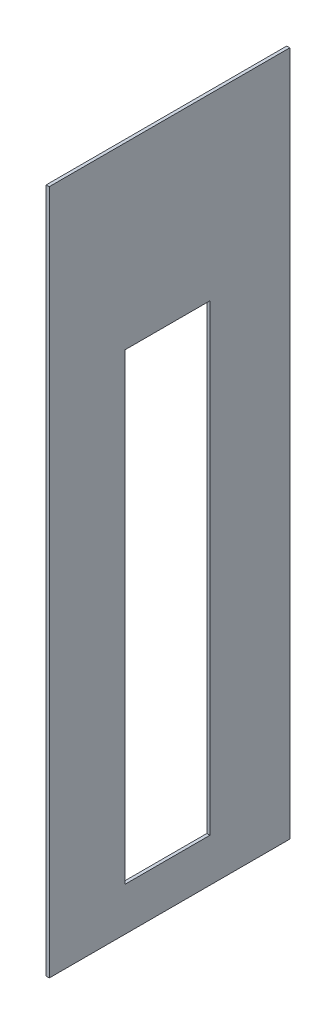
ISO-10303-21;
HEADER;
FILE_DESCRIPTION(('STEP AP214'),'2;1');
FILE_NAME('part.step','',(''),(''),'','','');
FILE_SCHEMA(('AUTOMOTIVE_DESIGN { 1 0 10303 214 1 1 1 1 }'));
ENDSEC;
DATA;
#1=APPLICATION_CONTEXT('core data for automotive mechanical design processes');
#2=APPLICATION_PROTOCOL_DEFINITION('international standard','automotive_design',2000,#1);
#3=PRODUCT_CONTEXT('',#1,'mechanical');
#4=PRODUCT('Part','Part','',(#3));
#5=PRODUCT_RELATED_PRODUCT_CATEGORY('part','',(#4));
#6=PRODUCT_DEFINITION_FORMATION('','',#4);
#7=PRODUCT_DEFINITION_CONTEXT('part definition',#1,'design');
#8=PRODUCT_DEFINITION('design','',#6,#7);
#9=PRODUCT_DEFINITION_SHAPE('','',#8);
#10=(LENGTH_UNIT() NAMED_UNIT(*) SI_UNIT(.MILLI.,.METRE.));
#11=(NAMED_UNIT(*) PLANE_ANGLE_UNIT() SI_UNIT($,.RADIAN.));
#12=(NAMED_UNIT(*) SI_UNIT($,.STERADIAN.) SOLID_ANGLE_UNIT());
#13=UNCERTAINTY_MEASURE_WITH_UNIT(LENGTH_MEASURE(1.E-05),#10,'distance_accuracy_value','');
#14=(GEOMETRIC_REPRESENTATION_CONTEXT(3) GLOBAL_UNCERTAINTY_ASSIGNED_CONTEXT((#13)) GLOBAL_UNIT_ASSIGNED_CONTEXT((#10,
#11,#12)) REPRESENTATION_CONTEXT('',''));
#15=CARTESIAN_POINT('',(0.,0.,0.));
#16=DIRECTION('',(0.,0.,1.));
#17=DIRECTION('',(1.,0.,0.));
#18=AXIS2_PLACEMENT_3D('',#15,#16,#17);
#19=CARTESIAN_POINT('',(1.,-9.84999999999989,3.40000000000003));
#20=DIRECTION('',(0.,-1.,0.));
#21=DIRECTION('',(0.,0.,-1.));
#22=AXIS2_PLACEMENT_3D('',#19,#20,#21);
#23=PLANE('',#22);
#24=DIRECTION('',(0.,0.,1.));
#25=VECTOR('',#24,1.);
#26=CARTESIAN_POINT('',(0.5,-9.84999999999989,3.40000000000003));
#27=LINE('',#26,#25);
#28=CARTESIAN_POINT('',(0.5,-9.84999999999989,3.40000000000003));
#29=VERTEX_POINT('',#28);
#30=CARTESIAN_POINT('',(0.5,-9.84999999999989,42.25));
#31=VERTEX_POINT('',#30);
#32=EDGE_CURVE('E132',#29,#31,#27,.T.);
#33=ORIENTED_EDGE('',*,*,#32,.F.);
#34=DIRECTION('',(-1.,0.,0.));
#35=VECTOR('',#34,1.);
#36=CARTESIAN_POINT('',(1.,-9.84999999999989,3.40000000000003));
#37=LINE('',#36,#35);
#38=CARTESIAN_POINT('',(1.,-9.84999999999989,3.40000000000003));
#39=VERTEX_POINT('',#38);
#40=EDGE_CURVE('E11',#39,#29,#37,.T.);
#41=ORIENTED_EDGE('',*,*,#40,.F.);
#42=DIRECTION('',(0.,0.,1.));
#43=VECTOR('',#42,1.);
#44=CARTESIAN_POINT('',(1.,-9.84999999999989,3.40000000000003));
#45=LINE('',#44,#43);
#46=CARTESIAN_POINT('',(1.,-9.84999999999989,42.25));
#47=VERTEX_POINT('',#46);
#48=EDGE_CURVE('E136',#39,#47,#45,.T.);
#49=ORIENTED_EDGE('',*,*,#48,.T.);
#50=DIRECTION('',(-1.,0.,0.));
#51=VECTOR('',#50,1.);
#52=CARTESIAN_POINT('',(1.,-9.84999999999989,42.25));
#53=LINE('',#52,#51);
#54=EDGE_CURVE('E37',#47,#31,#53,.T.);
#55=ORIENTED_EDGE('',*,*,#54,.T.);
#56=EDGE_LOOP('',(#33,#41,#49,#55));
#57=FACE_BOUND('',#56,.T.);
#58=ADVANCED_FACE('F34',(#57),#23,.T.);
#59=CARTESIAN_POINT('',(1.,100.85,3.40000000000002));
#60=DIRECTION('',(0.,0.,-1.));
#61=DIRECTION('',(0.,1.,0.));
#62=AXIS2_PLACEMENT_3D('',#59,#60,#61);
#63=PLANE('',#62);
#64=DIRECTION('',(0.,-1.,0.));
#65=VECTOR('',#64,1.);
#66=CARTESIAN_POINT('',(0.5,100.85,3.40000000000002));
#67=LINE('',#66,#65);
#68=CARTESIAN_POINT('',(0.5,100.85,3.40000000000002));
#69=VERTEX_POINT('',#68);
#70=EDGE_CURVE('E140',#69,#29,#67,.T.);
#71=ORIENTED_EDGE('',*,*,#70,.F.);
#72=DIRECTION('',(-1.,0.,0.));
#73=VECTOR('',#72,1.);
#74=CARTESIAN_POINT('',(1.,100.85,3.40000000000002));
#75=LINE('',#74,#73);
#76=CARTESIAN_POINT('',(1.,100.85,3.40000000000002));
#77=VERTEX_POINT('',#76);
#78=EDGE_CURVE('E42',#77,#69,#75,.T.);
#79=ORIENTED_EDGE('',*,*,#78,.F.);
#80=DIRECTION('',(0.,-1.,0.));
#81=VECTOR('',#80,1.);
#82=CARTESIAN_POINT('',(1.,100.85,3.40000000000002));
#83=LINE('',#82,#81);
#84=EDGE_CURVE('E146',#77,#39,#83,.T.);
#85=ORIENTED_EDGE('',*,*,#84,.T.);
#86=ORIENTED_EDGE('',*,*,#40,.T.);
#87=EDGE_LOOP('',(#71,#79,#85,#86));
#88=FACE_BOUND('',#87,.T.);
#89=ADVANCED_FACE('F172',(#88),#63,.T.);
#90=CARTESIAN_POINT('',(1.,100.85,42.25));
#91=DIRECTION('',(0.,1.,0.));
#92=DIRECTION('',(0.,0.,1.));
#93=AXIS2_PLACEMENT_3D('',#90,#91,#92);
#94=PLANE('',#93);
#95=DIRECTION('',(0.,0.,-1.));
#96=VECTOR('',#95,1.);
#97=CARTESIAN_POINT('',(0.5,100.85,42.25));
#98=LINE('',#97,#96);
#99=CARTESIAN_POINT('',(0.5,100.85,42.25));
#100=VERTEX_POINT('',#99);
#101=EDGE_CURVE('E154',#100,#69,#98,.T.);
#102=ORIENTED_EDGE('',*,*,#101,.F.);
#103=DIRECTION('',(-1.,0.,0.));
#104=VECTOR('',#103,1.);
#105=CARTESIAN_POINT('',(1.,100.85,42.25));
#106=LINE('',#105,#104);
#107=CARTESIAN_POINT('',(1.,100.85,42.25));
#108=VERTEX_POINT('',#107);
#109=EDGE_CURVE('E159',#108,#100,#106,.T.);
#110=ORIENTED_EDGE('',*,*,#109,.F.);
#111=DIRECTION('',(0.,0.,-1.));
#112=VECTOR('',#111,1.);
#113=CARTESIAN_POINT('',(1.,100.85,42.25));
#114=LINE('',#113,#112);
#115=EDGE_CURVE('E143',#108,#77,#114,.T.);
#116=ORIENTED_EDGE('',*,*,#115,.T.);
#117=ORIENTED_EDGE('',*,*,#78,.T.);
#118=EDGE_LOOP('',(#102,#110,#116,#117));
#119=FACE_BOUND('',#118,.T.);
#120=ADVANCED_FACE('F176',(#119),#94,.T.);
#121=CARTESIAN_POINT('',(1.,-9.84999999999989,42.25));
#122=DIRECTION('',(0.,0.,1.));
#123=DIRECTION('',(0.,-1.,0.));
#124=AXIS2_PLACEMENT_3D('',#121,#122,#123);
#125=PLANE('',#124);
#126=DIRECTION('',(0.,1.,0.));
#127=VECTOR('',#126,1.);
#128=CARTESIAN_POINT('',(0.5,-9.84999999999989,42.25));
#129=LINE('',#128,#127);
#130=EDGE_CURVE('E151',#31,#100,#129,.T.);
#131=ORIENTED_EDGE('',*,*,#130,.F.);
#132=ORIENTED_EDGE('',*,*,#54,.F.);
#133=DIRECTION('',(0.,1.,0.));
#134=VECTOR('',#133,1.);
#135=CARTESIAN_POINT('',(1.,-9.84999999999989,42.25));
#136=LINE('',#135,#134);
#137=EDGE_CURVE('E139',#47,#108,#136,.T.);
#138=ORIENTED_EDGE('',*,*,#137,.T.);
#139=ORIENTED_EDGE('',*,*,#109,.T.);
#140=EDGE_LOOP('',(#131,#132,#138,#139));
#141=FACE_BOUND('',#140,.T.);
#142=ADVANCED_FACE('F167',(#141),#125,.T.);
#143=CARTESIAN_POINT('',(1.,0.,0.));
#144=DIRECTION('',(-1.,0.,0.));
#145=DIRECTION('',(0.,0.,1.));
#146=AXIS2_PLACEMENT_3D('',#143,#144,#145);
#147=PLANE('',#146);
#148=DIRECTION('',(0.,4.37114345944438E-08,0.999999999999999));
#149=VECTOR('',#148,1.);
#150=CARTESIAN_POINT('',(1.,-2.85343451403459,30.0065614418577));
#151=LINE('',#150,#149);
#152=CARTESIAN_POINT('',(1.,-2.85343511300651,16.3036956761683));
#153=VERTEX_POINT('',#152);
#154=CARTESIAN_POINT('',(1.,-2.85343451403459,30.0065614418577));
#155=VERTEX_POINT('',#154);
#156=EDGE_CURVE('E107',#153,#155,#151,.T.);
#157=ORIENTED_EDGE('',*,*,#156,.T.);
#158=DIRECTION('',(0.,1.,0.));
#159=VECTOR('',#158,1.);
#160=CARTESIAN_POINT('',(1.,-2.85343451403459,30.0065614418577));
#161=LINE('',#160,#159);
#162=CARTESIAN_POINT('',(1.,71.9075332555905,30.0065614418577));
#163=VERTEX_POINT('',#162);
#164=EDGE_CURVE('E101',#155,#163,#161,.T.);
#165=ORIENTED_EDGE('',*,*,#164,.T.);
#166=DIRECTION('',(0.,0.,-1.));
#167=VECTOR('',#166,1.);
#168=CARTESIAN_POINT('',(1.,71.9075332555905,30.0065614418577));
#169=LINE('',#168,#167);
#170=CARTESIAN_POINT('',(1.,71.9075332555905,16.3036956761683));
#171=VERTEX_POINT('',#170);
#172=EDGE_CURVE('E110',#163,#171,#169,.T.);
#173=ORIENTED_EDGE('',*,*,#172,.T.);
#174=DIRECTION('',(0.,-1.,0.));
#175=VECTOR('',#174,1.);
#176=CARTESIAN_POINT('',(1.,-2.85343511300651,16.3036956761683));
#177=LINE('',#176,#175);
#178=EDGE_CURVE('E50',#171,#153,#177,.T.);
#179=ORIENTED_EDGE('',*,*,#178,.T.);
#180=EDGE_LOOP('',(#157,#165,#173,#179));
#181=FACE_BOUND('',#180,.T.);
#182=ORIENTED_EDGE('',*,*,#48,.F.);
#183=ORIENTED_EDGE('',*,*,#84,.F.);
#184=ORIENTED_EDGE('',*,*,#115,.F.);
#185=ORIENTED_EDGE('',*,*,#137,.F.);
#186=EDGE_LOOP('',(#182,#183,#184,#185));
#187=FACE_BOUND('',#186,.T.);
#188=ADVANCED_FACE('F114',(#181,#187),#147,.F.);
#189=CARTESIAN_POINT('',(0.5,0.,0.));
#190=DIRECTION('',(-1.,0.,0.));
#191=DIRECTION('',(0.,0.,1.));
#192=AXIS2_PLACEMENT_3D('',#189,#190,#191);
#193=PLANE('',#192);
#194=DIRECTION('',(0.,1.,0.));
#195=VECTOR('',#194,1.);
#196=CARTESIAN_POINT('',(0.5,-2.85343451403459,30.0065614418577));
#197=LINE('',#196,#195);
#198=CARTESIAN_POINT('',(0.5,-2.85343451403459,30.0065614418577));
#199=VERTEX_POINT('',#198);
#200=CARTESIAN_POINT('',(0.5,71.9075332555905,30.0065614418577));
#201=VERTEX_POINT('',#200);
#202=EDGE_CURVE('E58',#199,#201,#197,.T.);
#203=ORIENTED_EDGE('',*,*,#202,.F.);
#204=DIRECTION('',(0.,4.37114345944438E-08,0.999999999999999));
#205=VECTOR('',#204,1.);
#206=CARTESIAN_POINT('',(0.5,-2.85343451403459,30.0065614418577));
#207=LINE('',#206,#205);
#208=CARTESIAN_POINT('',(0.5,-2.85343511300651,16.3036956761683));
#209=VERTEX_POINT('',#208);
#210=EDGE_CURVE('E117',#209,#199,#207,.T.);
#211=ORIENTED_EDGE('',*,*,#210,.F.);
#212=DIRECTION('',(0.,-1.,0.));
#213=VECTOR('',#212,1.);
#214=CARTESIAN_POINT('',(0.5,-2.85343511300651,16.3036956761683));
#215=LINE('',#214,#213);
#216=CARTESIAN_POINT('',(0.5,71.9075332555905,16.3036956761683));
#217=VERTEX_POINT('',#216);
#218=EDGE_CURVE('E120',#217,#209,#215,.T.);
#219=ORIENTED_EDGE('',*,*,#218,.F.);
#220=DIRECTION('',(0.,0.,-1.));
#221=VECTOR('',#220,1.);
#222=CARTESIAN_POINT('',(0.5,71.9075332555905,30.0065614418577));
#223=LINE('',#222,#221);
#224=EDGE_CURVE('E126',#201,#217,#223,.T.);
#225=ORIENTED_EDGE('',*,*,#224,.F.);
#226=EDGE_LOOP('',(#203,#211,#219,#225));
#227=FACE_BOUND('',#226,.T.);
#228=ORIENTED_EDGE('',*,*,#32,.T.);
#229=ORIENTED_EDGE('',*,*,#130,.T.);
#230=ORIENTED_EDGE('',*,*,#101,.T.);
#231=ORIENTED_EDGE('',*,*,#70,.T.);
#232=EDGE_LOOP('',(#228,#229,#230,#231));
#233=FACE_BOUND('',#232,.T.);
#234=ADVANCED_FACE('F169',(#227,#233),#193,.T.);
#235=CARTESIAN_POINT('',(1.,-2.85343451403459,30.0065614418577));
#236=DIRECTION('',(0.,0.,1.));
#237=DIRECTION('',(1.,0.,0.));
#238=AXIS2_PLACEMENT_3D('',#235,#236,#237);
#239=PLANE('',#238);
#240=ORIENTED_EDGE('',*,*,#202,.T.);
#241=DIRECTION('',(-1.,0.,0.));
#242=VECTOR('',#241,1.);
#243=CARTESIAN_POINT('',(1.,71.9075332555905,30.0065614418577));
#244=LINE('',#243,#242);
#245=EDGE_CURVE('E97',#163,#201,#244,.T.);
#246=ORIENTED_EDGE('',*,*,#245,.F.);
#247=ORIENTED_EDGE('',*,*,#164,.F.);
#248=DIRECTION('',(-1.,0.,0.));
#249=VECTOR('',#248,1.);
#250=CARTESIAN_POINT('',(1.,-2.85343451403459,30.0065614418577));
#251=LINE('',#250,#249);
#252=EDGE_CURVE('E130',#155,#199,#251,.T.);
#253=ORIENTED_EDGE('',*,*,#252,.T.);
#254=EDGE_LOOP('',(#240,#246,#247,#253));
#255=FACE_BOUND('',#254,.T.);
#256=ADVANCED_FACE('F99',(#255),#239,.F.);
#257=CARTESIAN_POINT('',(1.,-2.85343451403459,30.0065614418577));
#258=DIRECTION('',(0.,-0.999999999999999,4.37114345944438E-08));
#259=DIRECTION('',(0.,-4.37114345944438E-08,-0.999999999999999));
#260=AXIS2_PLACEMENT_3D('',#257,#258,#259);
#261=PLANE('',#260);
#262=ORIENTED_EDGE('',*,*,#210,.T.);
#263=ORIENTED_EDGE('',*,*,#252,.F.);
#264=ORIENTED_EDGE('',*,*,#156,.F.);
#265=DIRECTION('',(-1.,0.,0.));
#266=VECTOR('',#265,1.);
#267=CARTESIAN_POINT('',(1.,-2.85343511300651,16.3036956761683));
#268=LINE('',#267,#266);
#269=EDGE_CURVE('E133',#153,#209,#268,.T.);
#270=ORIENTED_EDGE('',*,*,#269,.T.);
#271=EDGE_LOOP('',(#262,#263,#264,#270));
#272=FACE_BOUND('',#271,.T.);
#273=ADVANCED_FACE('F220',(#272),#261,.F.);
#274=CARTESIAN_POINT('',(1.,-2.85343511300651,16.3036956761683));
#275=DIRECTION('',(0.,0.,-1.));
#276=DIRECTION('',(-1.,0.,0.));
#277=AXIS2_PLACEMENT_3D('',#274,#275,#276);
#278=PLANE('',#277);
#279=ORIENTED_EDGE('',*,*,#218,.T.);
#280=ORIENTED_EDGE('',*,*,#269,.F.);
#281=ORIENTED_EDGE('',*,*,#178,.F.);
#282=DIRECTION('',(-1.,0.,0.));
#283=VECTOR('',#282,1.);
#284=CARTESIAN_POINT('',(1.,71.9075332555905,16.3036956761683));
#285=LINE('',#284,#283);
#286=EDGE_CURVE('E106',#171,#217,#285,.T.);
#287=ORIENTED_EDGE('',*,*,#286,.T.);
#288=EDGE_LOOP('',(#279,#280,#281,#287));
#289=FACE_BOUND('',#288,.T.);
#290=ADVANCED_FACE('F227',(#289),#278,.F.);
#291=CARTESIAN_POINT('',(1.,71.9075332555905,30.0065614418577));
#292=DIRECTION('',(0.,1.,0.));
#293=DIRECTION('',(0.,0.,1.));
#294=AXIS2_PLACEMENT_3D('',#291,#292,#293);
#295=PLANE('',#294);
#296=ORIENTED_EDGE('',*,*,#224,.T.);
#297=ORIENTED_EDGE('',*,*,#286,.F.);
#298=ORIENTED_EDGE('',*,*,#172,.F.);
#299=ORIENTED_EDGE('',*,*,#245,.T.);
#300=EDGE_LOOP('',(#296,#297,#298,#299));
#301=FACE_BOUND('',#300,.T.);
#302=ADVANCED_FACE('F111',(#301),#295,.F.);
#303=CLOSED_SHELL('',(#58,#89,#120,#142,#188,#234,#256,#273,#290,#302));
#304=MANIFOLD_SOLID_BREP('B2',#303);
#305=ADVANCED_BREP_SHAPE_REPRESENTATION('',(#18,#304),#14);
#306=SHAPE_DEFINITION_REPRESENTATION(#9,#305);
ENDSEC;
END-ISO-10303-21;
